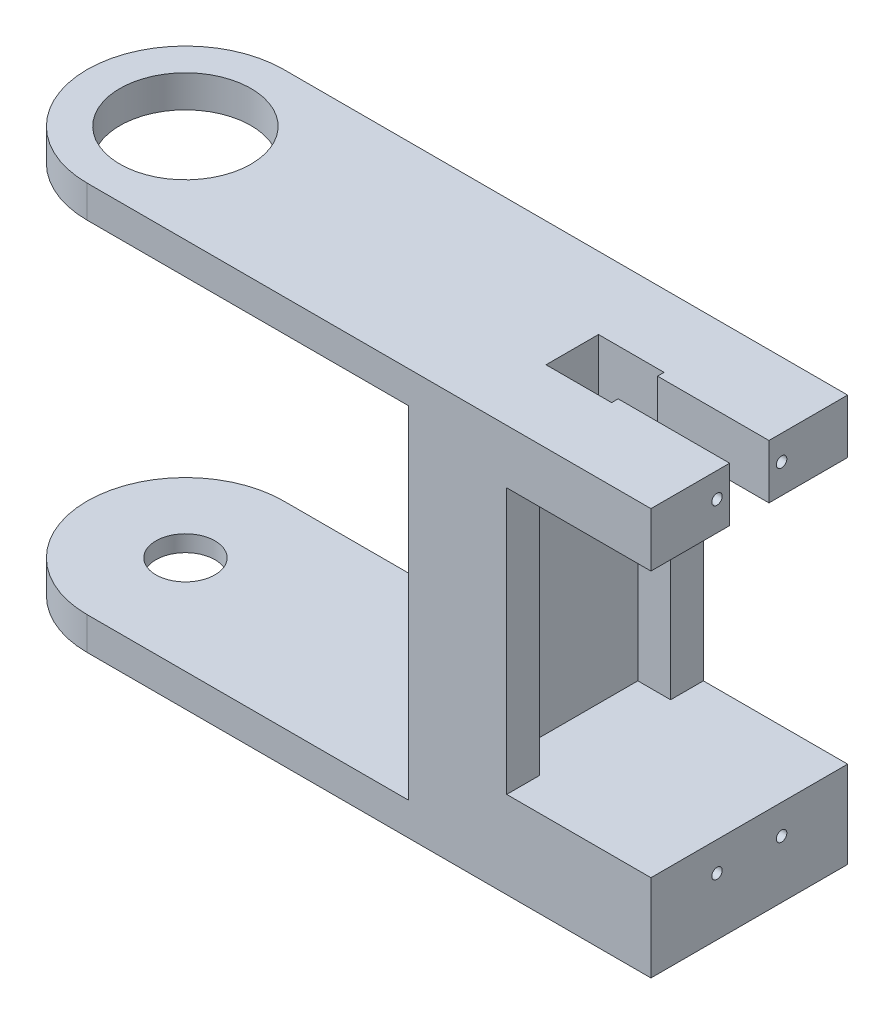
ISO-10303-21;
HEADER;
FILE_DESCRIPTION(('STEP AP214'),'2;1');
FILE_NAME('part.step','',(''),(''),'','','');
FILE_SCHEMA(('AUTOMOTIVE_DESIGN { 1 0 10303 214 1 1 1 1 }'));
ENDSEC;
DATA;
#1=APPLICATION_CONTEXT('core data for automotive mechanical design processes');
#2=APPLICATION_PROTOCOL_DEFINITION('international standard','automotive_design',2000,#1);
#3=PRODUCT_CONTEXT('',#1,'mechanical');
#4=PRODUCT('Part','Part','',(#3));
#5=PRODUCT_RELATED_PRODUCT_CATEGORY('part','',(#4));
#6=PRODUCT_DEFINITION_FORMATION('','',#4);
#7=PRODUCT_DEFINITION_CONTEXT('part definition',#1,'design');
#8=PRODUCT_DEFINITION('design','',#6,#7);
#9=PRODUCT_DEFINITION_SHAPE('','',#8);
#10=(LENGTH_UNIT() NAMED_UNIT(*) SI_UNIT(.MILLI.,.METRE.));
#11=(NAMED_UNIT(*) PLANE_ANGLE_UNIT() SI_UNIT($,.RADIAN.));
#12=(NAMED_UNIT(*) SI_UNIT($,.STERADIAN.) SOLID_ANGLE_UNIT());
#13=UNCERTAINTY_MEASURE_WITH_UNIT(LENGTH_MEASURE(1.E-05),#10,'distance_accuracy_value','');
#14=(GEOMETRIC_REPRESENTATION_CONTEXT(3) GLOBAL_UNCERTAINTY_ASSIGNED_CONTEXT((#13)) GLOBAL_UNIT_ASSIGNED_CONTEXT((#10,
#11,#12)) REPRESENTATION_CONTEXT('',''));
#15=CARTESIAN_POINT('',(0.,0.,0.));
#16=DIRECTION('',(0.,0.,1.));
#17=DIRECTION('',(1.,0.,0.));
#18=AXIS2_PLACEMENT_3D('',#15,#16,#17);
#19=CARTESIAN_POINT('',(-74.25,154.147469097395,15.));
#20=DIRECTION('',(0.,-1.,0.));
#21=DIRECTION('',(1.,0.,0.));
#22=AXIS2_PLACEMENT_3D('',#19,#20,#21);
#23=CYLINDRICAL_SURFACE('',#22,15.);
#24=DIRECTION('',(0.,-1.,0.));
#25=VECTOR('',#24,1.);
#26=CARTESIAN_POINT('',(-74.25,154.147469097395,30.));
#27=LINE('',#26,#25);
#28=CARTESIAN_POINT('',(-74.25,32.,30.));
#29=VERTEX_POINT('',#28);
#30=CARTESIAN_POINT('',(-74.25,27.,30.));
#31=VERTEX_POINT('',#30);
#32=EDGE_CURVE('E280',#29,#31,#27,.T.);
#33=ORIENTED_EDGE('',*,*,#32,.F.);
#34=CARTESIAN_POINT('',(-74.25,32.,15.));
#35=DIRECTION('',(0.,1.,0.));
#36=DIRECTION('',(0.,0.,1.));
#37=AXIS2_PLACEMENT_3D('',#34,#35,#36);
#38=CIRCLE('',#37,15.);
#39=CARTESIAN_POINT('',(-74.25,32.,0.));
#40=VERTEX_POINT('',#39);
#41=EDGE_CURVE('E12',#29,#40,#38,.F.);
#42=ORIENTED_EDGE('',*,*,#41,.T.);
#43=DIRECTION('',(0.,-1.,0.));
#44=VECTOR('',#43,1.);
#45=CARTESIAN_POINT('',(-74.25,154.147469097395,0.));
#46=LINE('',#45,#44);
#47=CARTESIAN_POINT('',(-74.25,27.,0.));
#48=VERTEX_POINT('',#47);
#49=EDGE_CURVE('E276',#40,#48,#46,.T.);
#50=ORIENTED_EDGE('',*,*,#49,.T.);
#51=CARTESIAN_POINT('',(-74.25,27.,15.));
#52=DIRECTION('',(0.,1.,0.));
#53=DIRECTION('',(1.,0.,0.));
#54=AXIS2_PLACEMENT_3D('',#51,#52,#53);
#55=CIRCLE('',#54,15.);
#56=EDGE_CURVE('E273',#48,#31,#55,.T.);
#57=ORIENTED_EDGE('',*,*,#56,.T.);
#58=EDGE_LOOP('',(#33,#42,#50,#57));
#59=FACE_BOUND('',#58,.T.);
#60=ADVANCED_FACE('F49',(#59),#23,.T.);
#61=CARTESIAN_POINT('',(-25.55,27.,-97.9443417280656));
#62=DIRECTION('',(0.,1.,0.));
#63=DIRECTION('',(-1.,0.,0.));
#64=AXIS2_PLACEMENT_3D('',#61,#62,#63);
#65=PLANE('',#64);
#66=CARTESIAN_POINT('',(-74.25,27.,15.));
#67=DIRECTION('',(0.,-1.,0.));
#68=DIRECTION('',(1.,0.,0.));
#69=AXIS2_PLACEMENT_3D('',#66,#67,#68);
#70=CIRCLE('',#69,10.5);
#71=CARTESIAN_POINT('',(-63.75,27.,15.));
#72=VERTEX_POINT('',#71);
#73=EDGE_CURVE('E261',#72,#72,#70,.T.);
#74=ORIENTED_EDGE('',*,*,#73,.F.);
#75=EDGE_LOOP('',(#74));
#76=FACE_BOUND('',#75,.T.);
#77=DIRECTION('',(-1.,0.,0.));
#78=VECTOR('',#77,1.);
#79=CARTESIAN_POINT('',(-25.55,27.,30.));
#80=LINE('',#79,#78);
#81=CARTESIAN_POINT('',(11.75,27.,30.));
#82=VERTEX_POINT('',#81);
#83=EDGE_CURVE('E499',#82,#31,#80,.T.);
#84=ORIENTED_EDGE('',*,*,#83,.T.);
#85=ORIENTED_EDGE('',*,*,#56,.F.);
#86=DIRECTION('',(1.,0.,0.));
#87=VECTOR('',#86,1.);
#88=CARTESIAN_POINT('',(-25.55,27.,0.));
#89=LINE('',#88,#87);
#90=CARTESIAN_POINT('',(11.75,27.,0.));
#91=VERTEX_POINT('',#90);
#92=EDGE_CURVE('E502',#48,#91,#89,.T.);
#93=ORIENTED_EDGE('',*,*,#92,.T.);
#94=DIRECTION('',(0.,0.,-1.));
#95=VECTOR('',#94,1.);
#96=CARTESIAN_POINT('',(11.75,27.,0.));
#97=LINE('',#96,#95);
#98=EDGE_CURVE('E257',#82,#91,#97,.T.);
#99=ORIENTED_EDGE('',*,*,#98,.F.);
#100=EDGE_LOOP('',(#84,#85,#93,#99));
#101=FACE_BOUND('',#100,.T.);
#102=ADVANCED_FACE('F548',(#76,#101),#65,.F.);
#103=CARTESIAN_POINT('',(-30.25,89.,-73.8782782690555));
#104=DIRECTION('',(0.,1.,0.));
#105=DIRECTION('',(0.,0.,1.));
#106=AXIS2_PLACEMENT_3D('',#103,#104,#105);
#107=PLANE('',#106);
#108=CARTESIAN_POINT('',(-74.25,89.,15.));
#109=DIRECTION('',(0.,1.,0.));
#110=DIRECTION('',(0.,0.,1.));
#111=AXIS2_PLACEMENT_3D('',#108,#109,#110);
#112=CIRCLE('',#111,15.);
#113=CARTESIAN_POINT('',(-74.25,89.,0.));
#114=VERTEX_POINT('',#113);
#115=CARTESIAN_POINT('',(-74.25,89.,30.));
#116=VERTEX_POINT('',#115);
#117=EDGE_CURVE('E277',#114,#116,#112,.T.);
#118=ORIENTED_EDGE('',*,*,#117,.T.);
#119=DIRECTION('',(-1.,0.,0.));
#120=VECTOR('',#119,1.);
#121=CARTESIAN_POINT('',(-30.25,89.,30.));
#122=LINE('',#121,#120);
#123=CARTESIAN_POINT('',(11.75,89.,30.));
#124=VERTEX_POINT('',#123);
#125=EDGE_CURVE('E495',#124,#116,#122,.T.);
#126=ORIENTED_EDGE('',*,*,#125,.F.);
#127=DIRECTION('',(0.,0.,1.));
#128=VECTOR('',#127,1.);
#129=CARTESIAN_POINT('',(11.75,89.,-73.8782782690555));
#130=LINE('',#129,#128);
#131=CARTESIAN_POINT('',(11.75,89.,18.));
#132=VERTEX_POINT('',#131);
#133=EDGE_CURVE('E506',#132,#124,#130,.T.);
#134=ORIENTED_EDGE('',*,*,#133,.F.);
#135=DIRECTION('',(1.,0.,0.));
#136=VECTOR('',#135,1.);
#137=CARTESIAN_POINT('',(-5.25000000000001,89.,18.));
#138=LINE('',#137,#136);
#139=CARTESIAN_POINT('',(-5.25000000000001,89.,18.));
#140=VERTEX_POINT('',#139);
#141=EDGE_CURVE('E391',#140,#132,#138,.T.);
#142=ORIENTED_EDGE('',*,*,#141,.F.);
#143=DIRECTION('',(0.,0.,-1.));
#144=VECTOR('',#143,1.);
#145=CARTESIAN_POINT('',(-5.25000000000001,89.,19.));
#146=LINE('',#145,#144);
#147=CARTESIAN_POINT('',(-5.25000000000001,89.,19.));
#148=VERTEX_POINT('',#147);
#149=EDGE_CURVE('E421',#148,#140,#146,.T.);
#150=ORIENTED_EDGE('',*,*,#149,.F.);
#151=DIRECTION('',(1.,0.,0.));
#152=VECTOR('',#151,1.);
#153=CARTESIAN_POINT('',(-15.25,89.,19.));
#154=LINE('',#153,#152);
#155=CARTESIAN_POINT('',(-15.25,89.,19.));
#156=VERTEX_POINT('',#155);
#157=EDGE_CURVE('E385',#156,#148,#154,.T.);
#158=ORIENTED_EDGE('',*,*,#157,.F.);
#159=DIRECTION('',(0.,0.,-1.));
#160=VECTOR('',#159,1.);
#161=CARTESIAN_POINT('',(-15.25,89.,19.));
#162=LINE('',#161,#160);
#163=CARTESIAN_POINT('',(-15.25,89.,11.));
#164=VERTEX_POINT('',#163);
#165=EDGE_CURVE('E398',#156,#164,#162,.T.);
#166=ORIENTED_EDGE('',*,*,#165,.T.);
#167=DIRECTION('',(1.,0.,0.));
#168=VECTOR('',#167,1.);
#169=CARTESIAN_POINT('',(-15.25,89.,11.));
#170=LINE('',#169,#168);
#171=CARTESIAN_POINT('',(-5.25000000000001,89.,11.));
#172=VERTEX_POINT('',#171);
#173=EDGE_CURVE('E436',#164,#172,#170,.T.);
#174=ORIENTED_EDGE('',*,*,#173,.T.);
#175=DIRECTION('',(0.,0.,1.));
#176=VECTOR('',#175,1.);
#177=CARTESIAN_POINT('',(-5.25000000000001,89.,11.));
#178=LINE('',#177,#176);
#179=CARTESIAN_POINT('',(-5.25000000000001,89.,12.));
#180=VERTEX_POINT('',#179);
#181=EDGE_CURVE('E431',#172,#180,#178,.T.);
#182=ORIENTED_EDGE('',*,*,#181,.T.);
#183=DIRECTION('',(1.,0.,0.));
#184=VECTOR('',#183,1.);
#185=CARTESIAN_POINT('',(-5.25000000000001,89.,12.));
#186=LINE('',#185,#184);
#187=CARTESIAN_POINT('',(11.75,89.,12.));
#188=VERTEX_POINT('',#187);
#189=EDGE_CURVE('E426',#180,#188,#186,.T.);
#190=ORIENTED_EDGE('',*,*,#189,.T.);
#191=CARTESIAN_POINT('',(11.75,89.,0.));
#192=VERTEX_POINT('',#191);
#193=EDGE_CURVE('E510',#192,#188,#130,.T.);
#194=ORIENTED_EDGE('',*,*,#193,.F.);
#195=DIRECTION('',(1.,0.,0.));
#196=VECTOR('',#195,1.);
#197=CARTESIAN_POINT('',(-30.25,89.,0.));
#198=LINE('',#197,#196);
#199=EDGE_CURVE('E496',#114,#192,#198,.T.);
#200=ORIENTED_EDGE('',*,*,#199,.F.);
#201=EDGE_LOOP('',(#118,#126,#134,#142,#150,#158,#166,#174,#182,#190,#194,#200));
#202=FACE_BOUND('',#201,.T.);
#203=CARTESIAN_POINT('',(-74.25,89.,15.));
#204=DIRECTION('',(0.,1.,0.));
#205=DIRECTION('',(0.,0.,1.));
#206=AXIS2_PLACEMENT_3D('',#203,#204,#205);
#207=CIRCLE('',#206,9.99999999999999);
#208=CARTESIAN_POINT('',(-64.25,89.,15.));
#209=VERTEX_POINT('',#208);
#210=EDGE_CURVE('E289',#209,#209,#207,.F.);
#211=ORIENTED_EDGE('',*,*,#210,.T.);
#212=EDGE_LOOP('',(#211));
#213=FACE_BOUND('',#212,.T.);
#214=ADVANCED_FACE('F572',(#202,#213),#107,.T.);
#215=CARTESIAN_POINT('',(-30.25,84.1,85.2268050859363));
#216=DIRECTION('',(0.,-1.,0.));
#217=DIRECTION('',(0.,0.,-1.));
#218=AXIS2_PLACEMENT_3D('',#215,#216,#217);
#219=PLANE('',#218);
#220=CARTESIAN_POINT('',(-74.25,84.1,15.));
#221=DIRECTION('',(0.,-1.,0.));
#222=DIRECTION('',(0.,0.,-1.));
#223=AXIS2_PLACEMENT_3D('',#220,#221,#222);
#224=CIRCLE('',#223,9.99999999999999);
#225=CARTESIAN_POINT('',(-64.25,84.1,15.));
#226=VERTEX_POINT('',#225);
#227=EDGE_CURVE('E293',#226,#226,#224,.T.);
#228=ORIENTED_EDGE('',*,*,#227,.F.);
#229=EDGE_LOOP('',(#228));
#230=FACE_BOUND('',#229,.T.);
#231=DIRECTION('',(-1.,0.,0.));
#232=VECTOR('',#231,1.);
#233=CARTESIAN_POINT('',(-30.25,84.1,30.));
#234=LINE('',#233,#232);
#235=CARTESIAN_POINT('',(-25.25,84.1,30.));
#236=VERTEX_POINT('',#235);
#237=CARTESIAN_POINT('',(-74.25,84.1,30.));
#238=VERTEX_POINT('',#237);
#239=EDGE_CURVE('E223',#236,#238,#234,.T.);
#240=ORIENTED_EDGE('',*,*,#239,.T.);
#241=CARTESIAN_POINT('',(-74.25,84.1,15.));
#242=DIRECTION('',(0.,-1.,0.));
#243=DIRECTION('',(0.,0.,-1.));
#244=AXIS2_PLACEMENT_3D('',#241,#242,#243);
#245=CIRCLE('',#244,15.);
#246=CARTESIAN_POINT('',(-74.25,84.1,0.));
#247=VERTEX_POINT('',#246);
#248=EDGE_CURVE('E286',#247,#238,#245,.F.);
#249=ORIENTED_EDGE('',*,*,#248,.F.);
#250=DIRECTION('',(-1.,0.,0.));
#251=VECTOR('',#250,1.);
#252=CARTESIAN_POINT('',(-30.25,84.1,0.));
#253=LINE('',#252,#251);
#254=CARTESIAN_POINT('',(-25.25,84.1,0.));
#255=VERTEX_POINT('',#254);
#256=EDGE_CURVE('E237',#255,#247,#253,.T.);
#257=ORIENTED_EDGE('',*,*,#256,.F.);
#258=DIRECTION('',(0.,0.,-1.));
#259=VECTOR('',#258,1.);
#260=CARTESIAN_POINT('',(-25.25,84.1,82.3393733244868));
#261=LINE('',#260,#259);
#262=EDGE_CURVE('E243',#236,#255,#261,.T.);
#263=ORIENTED_EDGE('',*,*,#262,.F.);
#264=EDGE_LOOP('',(#240,#249,#257,#263));
#265=FACE_BOUND('',#264,.T.);
#266=ADVANCED_FACE('F248',(#230,#265),#219,.T.);
#267=CARTESIAN_POINT('',(-30.25,32.,85.2268050859363));
#268=DIRECTION('',(0.,1.,0.));
#269=DIRECTION('',(0.,0.,1.));
#270=AXIS2_PLACEMENT_3D('',#267,#268,#269);
#271=PLANE('',#270);
#272=CARTESIAN_POINT('',(-74.25,32.,15.));
#273=DIRECTION('',(0.,1.,0.));
#274=DIRECTION('',(0.,0.,1.));
#275=AXIS2_PLACEMENT_3D('',#272,#273,#274);
#276=CIRCLE('',#275,4.5);
#277=CARTESIAN_POINT('',(-74.25,32.,19.5));
#278=VERTEX_POINT('',#277);
#279=EDGE_CURVE('E269',#278,#278,#276,.F.);
#280=ORIENTED_EDGE('',*,*,#279,.T.);
#281=EDGE_LOOP('',(#280));
#282=FACE_BOUND('',#281,.T.);
#283=DIRECTION('',(1.,0.,0.));
#284=VECTOR('',#283,1.);
#285=CARTESIAN_POINT('',(-30.25,32.,30.));
#286=LINE('',#285,#284);
#287=CARTESIAN_POINT('',(-25.25,32.,30.));
#288=VERTEX_POINT('',#287);
#289=EDGE_CURVE('E299',#29,#288,#286,.T.);
#290=ORIENTED_EDGE('',*,*,#289,.T.);
#291=DIRECTION('',(0.,0.,-1.));
#292=VECTOR('',#291,1.);
#293=CARTESIAN_POINT('',(-25.25,32.,82.3393733244868));
#294=LINE('',#293,#292);
#295=CARTESIAN_POINT('',(-25.25,32.,0.));
#296=VERTEX_POINT('',#295);
#297=EDGE_CURVE('E245',#288,#296,#294,.T.);
#298=ORIENTED_EDGE('',*,*,#297,.T.);
#299=DIRECTION('',(1.,0.,0.));
#300=VECTOR('',#299,1.);
#301=CARTESIAN_POINT('',(-30.25,32.,0.));
#302=LINE('',#301,#300);
#303=EDGE_CURVE('E66',#40,#296,#302,.T.);
#304=ORIENTED_EDGE('',*,*,#303,.F.);
#305=ORIENTED_EDGE('',*,*,#41,.F.);
#306=EDGE_LOOP('',(#290,#298,#304,#305));
#307=FACE_BOUND('',#306,.T.);
#308=ADVANCED_FACE('F555',(#282,#307),#271,.T.);
#309=CARTESIAN_POINT('',(-15.25,80.75,-78.4263811282179));
#310=DIRECTION('',(-1.,0.,0.));
#311=DIRECTION('',(0.,-1.,0.));
#312=AXIS2_PLACEMENT_3D('',#309,#310,#311);
#313=PLANE('',#312);
#314=DIRECTION('',(0.,-1.,0.));
#315=VECTOR('',#314,1.);
#316=CARTESIAN_POINT('',(-15.25,80.75,5.));
#317=LINE('',#316,#315);
#318=CARTESIAN_POINT('',(-15.25,80.75,4.99999999999998));
#319=VERTEX_POINT('',#318);
#320=CARTESIAN_POINT('',(-15.25,40.25,4.99999999999998));
#321=VERTEX_POINT('',#320);
#322=EDGE_CURVE('E335',#319,#321,#317,.T.);
#323=ORIENTED_EDGE('',*,*,#322,.F.);
#324=DIRECTION('',(0.,0.,1.));
#325=VECTOR('',#324,1.);
#326=CARTESIAN_POINT('',(-15.25,80.75,-78.4263811282179));
#327=LINE('',#326,#325);
#328=CARTESIAN_POINT('',(-15.25,80.75,11.));
#329=VERTEX_POINT('',#328);
#330=EDGE_CURVE('E457',#319,#329,#327,.T.);
#331=ORIENTED_EDGE('',*,*,#330,.T.);
#332=DIRECTION('',(0.,-1.,0.));
#333=VECTOR('',#332,1.);
#334=CARTESIAN_POINT('',(-15.25,139.635955604689,11.));
#335=LINE('',#334,#333);
#336=EDGE_CURVE('E418',#164,#329,#335,.T.);
#337=ORIENTED_EDGE('',*,*,#336,.F.);
#338=ORIENTED_EDGE('',*,*,#165,.F.);
#339=DIRECTION('',(0.,-1.,0.));
#340=VECTOR('',#339,1.);
#341=CARTESIAN_POINT('',(-15.25,139.635955604689,19.));
#342=LINE('',#341,#340);
#343=CARTESIAN_POINT('',(-15.25,80.75,19.));
#344=VERTEX_POINT('',#343);
#345=EDGE_CURVE('E409',#156,#344,#342,.T.);
#346=ORIENTED_EDGE('',*,*,#345,.T.);
#347=CARTESIAN_POINT('',(-15.25,80.75,25.));
#348=VERTEX_POINT('',#347);
#349=EDGE_CURVE('E481',#344,#348,#327,.T.);
#350=ORIENTED_EDGE('',*,*,#349,.T.);
#351=DIRECTION('',(0.,1.,0.));
#352=VECTOR('',#351,1.);
#353=CARTESIAN_POINT('',(-15.25,80.75,25.));
#354=LINE('',#353,#352);
#355=CARTESIAN_POINT('',(-15.25,40.25,25.));
#356=VERTEX_POINT('',#355);
#357=EDGE_CURVE('E362',#356,#348,#354,.T.);
#358=ORIENTED_EDGE('',*,*,#357,.F.);
#359=DIRECTION('',(0.,0.,1.));
#360=VECTOR('',#359,1.);
#361=CARTESIAN_POINT('',(-15.25,40.25,-78.4263811282179));
#362=LINE('',#361,#360);
#363=EDGE_CURVE('E478',#321,#356,#362,.T.);
#364=ORIENTED_EDGE('',*,*,#363,.F.);
#365=EDGE_LOOP('',(#323,#331,#337,#338,#346,#350,#358,#364));
#366=FACE_BOUND('',#365,.T.);
#367=ADVANCED_FACE('F589',(#366),#313,.F.);
#368=CARTESIAN_POINT('',(-15.25,40.25,-78.4263811282179));
#369=DIRECTION('',(0.,-1.,0.));
#370=DIRECTION('',(1.,0.,0.));
#371=AXIS2_PLACEMENT_3D('',#368,#369,#370);
#372=PLANE('',#371);
#373=DIRECTION('',(-1.,0.,0.));
#374=VECTOR('',#373,1.);
#375=CARTESIAN_POINT('',(-10.25,40.25,5.));
#376=LINE('',#375,#374);
#377=CARTESIAN_POINT('',(-10.25,40.25,5.));
#378=VERTEX_POINT('',#377);
#379=EDGE_CURVE('E352',#378,#321,#376,.T.);
#380=ORIENTED_EDGE('',*,*,#379,.T.);
#381=ORIENTED_EDGE('',*,*,#363,.T.);
#382=DIRECTION('',(-1.,0.,0.));
#383=VECTOR('',#382,1.);
#384=CARTESIAN_POINT('',(-10.25,40.25,25.));
#385=LINE('',#384,#383);
#386=CARTESIAN_POINT('',(-10.25,40.25,25.));
#387=VERTEX_POINT('',#386);
#388=EDGE_CURVE('E381',#387,#356,#385,.T.);
#389=ORIENTED_EDGE('',*,*,#388,.F.);
#390=DIRECTION('',(0.,0.,-1.));
#391=VECTOR('',#390,1.);
#392=CARTESIAN_POINT('',(-10.25,40.25,30.));
#393=LINE('',#392,#391);
#394=CARTESIAN_POINT('',(-10.25,40.25,30.));
#395=VERTEX_POINT('',#394);
#396=EDGE_CURVE('E366',#395,#387,#393,.T.);
#397=ORIENTED_EDGE('',*,*,#396,.F.);
#398=DIRECTION('',(1.,0.,0.));
#399=VECTOR('',#398,1.);
#400=CARTESIAN_POINT('',(-15.25,40.25,30.));
#401=LINE('',#400,#399);
#402=CARTESIAN_POINT('',(11.75,40.25,30.));
#403=VERTEX_POINT('',#402);
#404=EDGE_CURVE('E414',#395,#403,#401,.T.);
#405=ORIENTED_EDGE('',*,*,#404,.T.);
#406=DIRECTION('',(0.,0.,1.));
#407=VECTOR('',#406,1.);
#408=CARTESIAN_POINT('',(11.75,40.25,-78.4263811282179));
#409=LINE('',#408,#407);
#410=CARTESIAN_POINT('',(11.75,40.25,0.));
#411=VERTEX_POINT('',#410);
#412=EDGE_CURVE('E487',#411,#403,#409,.T.);
#413=ORIENTED_EDGE('',*,*,#412,.F.);
#414=DIRECTION('',(-1.,0.,0.));
#415=VECTOR('',#414,1.);
#416=CARTESIAN_POINT('',(-15.25,40.25,0.));
#417=LINE('',#416,#415);
#418=CARTESIAN_POINT('',(-10.25,40.25,0.));
#419=VERTEX_POINT('',#418);
#420=EDGE_CURVE('E464',#411,#419,#417,.T.);
#421=ORIENTED_EDGE('',*,*,#420,.T.);
#422=DIRECTION('',(0.,0.,-1.));
#423=VECTOR('',#422,1.);
#424=CARTESIAN_POINT('',(-10.25,40.25,0.));
#425=LINE('',#424,#423);
#426=EDGE_CURVE('E348',#378,#419,#425,.T.);
#427=ORIENTED_EDGE('',*,*,#426,.F.);
#428=EDGE_LOOP('',(#380,#381,#389,#397,#405,#413,#421,#427));
#429=FACE_BOUND('',#428,.T.);
#430=ADVANCED_FACE('F537',(#429),#372,.F.);
#431=CARTESIAN_POINT('',(-15.25,80.75,-78.4263811282179));
#432=DIRECTION('',(0.,1.,0.));
#433=DIRECTION('',(0.,0.,1.));
#434=AXIS2_PLACEMENT_3D('',#431,#432,#433);
#435=PLANE('',#434);
#436=DIRECTION('',(-1.,0.,0.));
#437=VECTOR('',#436,1.);
#438=CARTESIAN_POINT('',(-10.25,80.75,5.));
#439=LINE('',#438,#437);
#440=CARTESIAN_POINT('',(-10.25,80.75,5.));
#441=VERTEX_POINT('',#440);
#442=EDGE_CURVE('E358',#441,#319,#439,.T.);
#443=ORIENTED_EDGE('',*,*,#442,.F.);
#444=DIRECTION('',(0.,0.,1.));
#445=VECTOR('',#444,1.);
#446=CARTESIAN_POINT('',(-10.25,80.75,0.));
#447=LINE('',#446,#445);
#448=CARTESIAN_POINT('',(-10.25,80.75,0.));
#449=VERTEX_POINT('',#448);
#450=EDGE_CURVE('E340',#449,#441,#447,.T.);
#451=ORIENTED_EDGE('',*,*,#450,.F.);
#452=DIRECTION('',(1.,0.,0.));
#453=VECTOR('',#452,1.);
#454=CARTESIAN_POINT('',(-15.25,80.75,0.));
#455=LINE('',#454,#453);
#456=CARTESIAN_POINT('',(11.75,80.75,0.));
#457=VERTEX_POINT('',#456);
#458=EDGE_CURVE('E461',#449,#457,#455,.T.);
#459=ORIENTED_EDGE('',*,*,#458,.T.);
#460=DIRECTION('',(0.,0.,1.));
#461=VECTOR('',#460,1.);
#462=CARTESIAN_POINT('',(11.75,80.75,-78.4263811282179));
#463=LINE('',#462,#461);
#464=CARTESIAN_POINT('',(11.75,80.75,12.));
#465=VERTEX_POINT('',#464);
#466=EDGE_CURVE('E482',#457,#465,#463,.T.);
#467=ORIENTED_EDGE('',*,*,#466,.T.);
#468=DIRECTION('',(1.,0.,0.));
#469=VECTOR('',#468,1.);
#470=CARTESIAN_POINT('',(-5.25000000000001,80.75,12.));
#471=LINE('',#470,#469);
#472=CARTESIAN_POINT('',(-5.25000000000001,80.75,12.));
#473=VERTEX_POINT('',#472);
#474=EDGE_CURVE('E395',#473,#465,#471,.T.);
#475=ORIENTED_EDGE('',*,*,#474,.F.);
#476=DIRECTION('',(0.,0.,1.));
#477=VECTOR('',#476,1.);
#478=CARTESIAN_POINT('',(-5.25000000000001,80.75,11.));
#479=LINE('',#478,#477);
#480=CARTESIAN_POINT('',(-5.25000000000001,80.75,11.));
#481=VERTEX_POINT('',#480);
#482=EDGE_CURVE('E390',#481,#473,#479,.T.);
#483=ORIENTED_EDGE('',*,*,#482,.F.);
#484=DIRECTION('',(1.,0.,0.));
#485=VECTOR('',#484,1.);
#486=CARTESIAN_POINT('',(-15.25,80.75,11.));
#487=LINE('',#486,#485);
#488=EDGE_CURVE('E386',#329,#481,#487,.T.);
#489=ORIENTED_EDGE('',*,*,#488,.F.);
#490=ORIENTED_EDGE('',*,*,#330,.F.);
#491=EDGE_LOOP('',(#443,#451,#459,#467,#475,#483,#489,#490));
#492=FACE_BOUND('',#491,.T.);
#493=ADVANCED_FACE('F527',(#492),#435,.F.);
#494=DIRECTION('',(-1.,0.,0.));
#495=VECTOR('',#494,1.);
#496=CARTESIAN_POINT('',(-10.25,80.75,25.));
#497=LINE('',#496,#495);
#498=CARTESIAN_POINT('',(-10.25,80.75,25.));
#499=VERTEX_POINT('',#498);
#500=EDGE_CURVE('E375',#499,#348,#497,.T.);
#501=ORIENTED_EDGE('',*,*,#500,.T.);
#502=ORIENTED_EDGE('',*,*,#349,.F.);
#503=DIRECTION('',(1.,0.,0.));
#504=VECTOR('',#503,1.);
#505=CARTESIAN_POINT('',(-15.25,80.75,19.));
#506=LINE('',#505,#504);
#507=CARTESIAN_POINT('',(-5.25000000000001,80.75,19.));
#508=VERTEX_POINT('',#507);
#509=EDGE_CURVE('E410',#344,#508,#506,.T.);
#510=ORIENTED_EDGE('',*,*,#509,.T.);
#511=DIRECTION('',(0.,0.,-1.));
#512=VECTOR('',#511,1.);
#513=CARTESIAN_POINT('',(-5.25000000000001,80.75,19.));
#514=LINE('',#513,#512);
#515=CARTESIAN_POINT('',(-5.25000000000001,80.75,18.));
#516=VERTEX_POINT('',#515);
#517=EDGE_CURVE('E405',#508,#516,#514,.T.);
#518=ORIENTED_EDGE('',*,*,#517,.T.);
#519=DIRECTION('',(1.,0.,0.));
#520=VECTOR('',#519,1.);
#521=CARTESIAN_POINT('',(-5.25000000000001,80.75,18.));
#522=LINE('',#521,#520);
#523=CARTESIAN_POINT('',(11.75,80.75,18.));
#524=VERTEX_POINT('',#523);
#525=EDGE_CURVE('E399',#516,#524,#522,.T.);
#526=ORIENTED_EDGE('',*,*,#525,.T.);
#527=CARTESIAN_POINT('',(11.75,80.75,30.));
#528=VERTEX_POINT('',#527);
#529=EDGE_CURVE('E486',#524,#528,#463,.T.);
#530=ORIENTED_EDGE('',*,*,#529,.T.);
#531=DIRECTION('',(-1.,0.,0.));
#532=VECTOR('',#531,1.);
#533=CARTESIAN_POINT('',(-15.25,80.75,30.));
#534=LINE('',#533,#532);
#535=CARTESIAN_POINT('',(-10.25,80.75,30.));
#536=VERTEX_POINT('',#535);
#537=EDGE_CURVE('E474',#528,#536,#534,.T.);
#538=ORIENTED_EDGE('',*,*,#537,.T.);
#539=DIRECTION('',(0.,0.,1.));
#540=VECTOR('',#539,1.);
#541=CARTESIAN_POINT('',(-10.25,80.75,30.));
#542=LINE('',#541,#540);
#543=EDGE_CURVE('E372',#499,#536,#542,.T.);
#544=ORIENTED_EDGE('',*,*,#543,.F.);
#545=EDGE_LOOP('',(#501,#502,#510,#518,#526,#530,#538,#544));
#546=FACE_BOUND('',#545,.T.);
#547=ADVANCED_FACE('F604',(#546),#435,.F.);
#548=CARTESIAN_POINT('',(11.75,101.149817475309,-78.4263811282179));
#549=DIRECTION('',(-1.,0.,0.));
#550=DIRECTION('',(0.,0.,1.));
#551=AXIS2_PLACEMENT_3D('',#548,#549,#550);
#552=PLANE('',#551);
#553=CARTESIAN_POINT('',(11.75,85.21,19.925));
#554=DIRECTION('',(1.,0.,0.));
#555=DIRECTION('',(0.,0.,-1.));
#556=AXIS2_PLACEMENT_3D('',#553,#554,#555);
#557=CIRCLE('',#556,0.799999999999995);
#558=CARTESIAN_POINT('',(11.75,85.21,19.125));
#559=VERTEX_POINT('',#558);
#560=EDGE_CURVE('E236',#559,#559,#557,.T.);
#561=ORIENTED_EDGE('',*,*,#560,.F.);
#562=EDGE_LOOP('',(#561));
#563=FACE_BOUND('',#562,.T.);
#564=DIRECTION('',(0.,-1.,0.));
#565=VECTOR('',#564,1.);
#566=CARTESIAN_POINT('',(11.75,101.149817475309,18.));
#567=LINE('',#566,#565);
#568=EDGE_CURVE('E514',#132,#524,#567,.T.);
#569=ORIENTED_EDGE('',*,*,#568,.F.);
#570=ORIENTED_EDGE('',*,*,#133,.T.);
#571=DIRECTION('',(0.,-1.,0.));
#572=VECTOR('',#571,1.);
#573=CARTESIAN_POINT('',(11.75,101.149817475309,30.));
#574=LINE('',#573,#572);
#575=EDGE_CURVE('E470',#124,#528,#574,.T.);
#576=ORIENTED_EDGE('',*,*,#575,.T.);
#577=ORIENTED_EDGE('',*,*,#529,.F.);
#578=EDGE_LOOP('',(#569,#570,#576,#577));
#579=FACE_BOUND('',#578,.T.);
#580=ADVANCED_FACE('F565',(#563,#579),#552,.F.);
#581=CARTESIAN_POINT('',(0.,0.,30.));
#582=DIRECTION('',(0.,0.,1.));
#583=DIRECTION('',(1.,0.,0.));
#584=AXIS2_PLACEMENT_3D('',#581,#582,#583);
#585=PLANE('',#584);
#586=ORIENTED_EDGE('',*,*,#239,.F.);
#587=DIRECTION('',(0.,-1.,0.));
#588=VECTOR('',#587,1.);
#589=CARTESIAN_POINT('',(-25.25,84.1,30.));
#590=LINE('',#589,#588);
#591=EDGE_CURVE('E227',#236,#288,#590,.T.);
#592=ORIENTED_EDGE('',*,*,#591,.T.);
#593=ORIENTED_EDGE('',*,*,#289,.F.);
#594=ORIENTED_EDGE('',*,*,#32,.T.);
#595=ORIENTED_EDGE('',*,*,#83,.F.);
#596=DIRECTION('',(0.,-1.,0.));
#597=VECTOR('',#596,1.);
#598=CARTESIAN_POINT('',(11.75,40.25,30.));
#599=LINE('',#598,#597);
#600=EDGE_CURVE('E467',#403,#82,#599,.T.);
#601=ORIENTED_EDGE('',*,*,#600,.F.);
#602=ORIENTED_EDGE('',*,*,#404,.F.);
#603=DIRECTION('',(0.,-1.,0.));
#604=VECTOR('',#603,1.);
#605=CARTESIAN_POINT('',(-10.25,80.75,30.));
#606=LINE('',#605,#604);
#607=EDGE_CURVE('E363',#536,#395,#606,.T.);
#608=ORIENTED_EDGE('',*,*,#607,.F.);
#609=ORIENTED_EDGE('',*,*,#537,.F.);
#610=ORIENTED_EDGE('',*,*,#575,.F.);
#611=ORIENTED_EDGE('',*,*,#125,.T.);
#612=EDGE_CURVE('E230',#116,#238,#27,.T.);
#613=ORIENTED_EDGE('',*,*,#612,.T.);
#614=EDGE_LOOP('',(#586,#592,#593,#594,#595,#601,#602,#608,#609,#610,#611,#613));
#615=FACE_BOUND('',#614,.T.);
#616=ADVANCED_FACE('F225',(#615),#585,.T.);
#617=CARTESIAN_POINT('',(0.,0.,0.));
#618=DIRECTION('',(0.,0.,1.));
#619=DIRECTION('',(1.,0.,0.));
#620=AXIS2_PLACEMENT_3D('',#617,#618,#619);
#621=PLANE('',#620);
#622=DIRECTION('',(0.,-1.,0.));
#623=VECTOR('',#622,1.);
#624=CARTESIAN_POINT('',(-25.25,84.1,0.));
#625=LINE('',#624,#623);
#626=EDGE_CURVE('E251',#255,#296,#625,.T.);
#627=ORIENTED_EDGE('',*,*,#626,.F.);
#628=ORIENTED_EDGE('',*,*,#256,.T.);
#629=EDGE_CURVE('E281',#114,#247,#46,.T.);
#630=ORIENTED_EDGE('',*,*,#629,.F.);
#631=ORIENTED_EDGE('',*,*,#199,.T.);
#632=DIRECTION('',(0.,1.,0.));
#633=VECTOR('',#632,1.);
#634=CARTESIAN_POINT('',(11.75,101.149817475309,0.));
#635=LINE('',#634,#633);
#636=EDGE_CURVE('E456',#457,#192,#635,.T.);
#637=ORIENTED_EDGE('',*,*,#636,.F.);
#638=ORIENTED_EDGE('',*,*,#458,.F.);
#639=DIRECTION('',(0.,1.,0.));
#640=VECTOR('',#639,1.);
#641=CARTESIAN_POINT('',(-10.25,80.75,0.));
#642=LINE('',#641,#640);
#643=EDGE_CURVE('E336',#419,#449,#642,.T.);
#644=ORIENTED_EDGE('',*,*,#643,.F.);
#645=ORIENTED_EDGE('',*,*,#420,.F.);
#646=DIRECTION('',(0.,1.,0.));
#647=VECTOR('',#646,1.);
#648=CARTESIAN_POINT('',(11.75,40.25,0.));
#649=LINE('',#648,#647);
#650=EDGE_CURVE('E453',#91,#411,#649,.T.);
#651=ORIENTED_EDGE('',*,*,#650,.F.);
#652=ORIENTED_EDGE('',*,*,#92,.F.);
#653=ORIENTED_EDGE('',*,*,#49,.F.);
#654=ORIENTED_EDGE('',*,*,#303,.T.);
#655=EDGE_LOOP('',(#627,#628,#630,#631,#637,#638,#644,#645,#651,#652,#653,#654));
#656=FACE_BOUND('',#655,.T.);
#657=ADVANCED_FACE('F51',(#656),#621,.F.);
#658=CARTESIAN_POINT('',(11.75,85.21,10.075));
#659=DIRECTION('',(1.,0.,0.));
#660=DIRECTION('',(0.,0.,-1.));
#661=AXIS2_PLACEMENT_3D('',#658,#659,#660);
#662=CIRCLE('',#661,0.799999999999995);
#663=CARTESIAN_POINT('',(11.75,85.21,9.275));
#664=VERTEX_POINT('',#663);
#665=EDGE_CURVE('E311',#664,#664,#662,.T.);
#666=ORIENTED_EDGE('',*,*,#665,.F.);
#667=EDGE_LOOP('',(#666));
#668=FACE_BOUND('',#667,.T.);
#669=ORIENTED_EDGE('',*,*,#193,.T.);
#670=DIRECTION('',(0.,-1.,0.));
#671=VECTOR('',#670,1.);
#672=CARTESIAN_POINT('',(11.75,101.149817475309,12.));
#673=LINE('',#672,#671);
#674=EDGE_CURVE('E59',#188,#465,#673,.T.);
#675=ORIENTED_EDGE('',*,*,#674,.T.);
#676=ORIENTED_EDGE('',*,*,#466,.F.);
#677=ORIENTED_EDGE('',*,*,#636,.T.);
#678=EDGE_LOOP('',(#669,#675,#676,#677));
#679=FACE_BOUND('',#678,.T.);
#680=ADVANCED_FACE('F521',(#668,#679),#552,.F.);
#681=CARTESIAN_POINT('',(11.75,40.25,-78.4263811282179));
#682=DIRECTION('',(-1.,0.,0.));
#683=DIRECTION('',(0.,-1.,0.));
#684=AXIS2_PLACEMENT_3D('',#681,#682,#683);
#685=PLANE('',#684);
#686=CARTESIAN_POINT('',(11.75,35.79,10.075));
#687=DIRECTION('',(1.,0.,0.));
#688=DIRECTION('',(0.,0.,-1.));
#689=AXIS2_PLACEMENT_3D('',#686,#687,#688);
#690=CIRCLE('',#689,0.799999999999988);
#691=CARTESIAN_POINT('',(11.75,35.79,9.275));
#692=VERTEX_POINT('',#691);
#693=EDGE_CURVE('E319',#692,#692,#690,.T.);
#694=ORIENTED_EDGE('',*,*,#693,.F.);
#695=EDGE_LOOP('',(#694));
#696=FACE_BOUND('',#695,.T.);
#697=CARTESIAN_POINT('',(11.75,35.79,19.925));
#698=DIRECTION('',(1.,0.,0.));
#699=DIRECTION('',(0.,0.,-1.));
#700=AXIS2_PLACEMENT_3D('',#697,#698,#699);
#701=CIRCLE('',#700,0.799999999999988);
#702=CARTESIAN_POINT('',(11.75,35.79,19.125));
#703=VERTEX_POINT('',#702);
#704=EDGE_CURVE('E327',#703,#703,#701,.T.);
#705=ORIENTED_EDGE('',*,*,#704,.F.);
#706=EDGE_LOOP('',(#705));
#707=FACE_BOUND('',#706,.T.);
#708=ORIENTED_EDGE('',*,*,#650,.T.);
#709=ORIENTED_EDGE('',*,*,#412,.T.);
#710=ORIENTED_EDGE('',*,*,#600,.T.);
#711=ORIENTED_EDGE('',*,*,#98,.T.);
#712=EDGE_LOOP('',(#708,#709,#710,#711));
#713=FACE_BOUND('',#712,.T.);
#714=ADVANCED_FACE('F543',(#696,#707,#713),#685,.F.);
#715=CARTESIAN_POINT('',(-5.25000000000001,139.635955604689,12.));
#716=DIRECTION('',(0.,0.,-1.));
#717=DIRECTION('',(-1.,0.,0.));
#718=AXIS2_PLACEMENT_3D('',#715,#716,#717);
#719=PLANE('',#718);
#720=ORIENTED_EDGE('',*,*,#189,.F.);
#721=DIRECTION('',(0.,-1.,0.));
#722=VECTOR('',#721,1.);
#723=CARTESIAN_POINT('',(-5.25000000000001,139.635955604689,12.));
#724=LINE('',#723,#722);
#725=EDGE_CURVE('E430',#180,#473,#724,.T.);
#726=ORIENTED_EDGE('',*,*,#725,.T.);
#727=ORIENTED_EDGE('',*,*,#474,.T.);
#728=ORIENTED_EDGE('',*,*,#674,.F.);
#729=EDGE_LOOP('',(#720,#726,#727,#728));
#730=FACE_BOUND('',#729,.T.);
#731=ADVANCED_FACE('F579',(#730),#719,.F.);
#732=CARTESIAN_POINT('',(-5.25000000000001,139.635955604689,18.));
#733=DIRECTION('',(0.,0.,-1.));
#734=DIRECTION('',(-1.,0.,0.));
#735=AXIS2_PLACEMENT_3D('',#732,#733,#734);
#736=PLANE('',#735);
#737=ORIENTED_EDGE('',*,*,#568,.T.);
#738=ORIENTED_EDGE('',*,*,#525,.F.);
#739=DIRECTION('',(0.,-1.,0.));
#740=VECTOR('',#739,1.);
#741=CARTESIAN_POINT('',(-5.25000000000001,139.635955604689,18.));
#742=LINE('',#741,#740);
#743=EDGE_CURVE('E404',#140,#516,#742,.T.);
#744=ORIENTED_EDGE('',*,*,#743,.F.);
#745=ORIENTED_EDGE('',*,*,#141,.T.);
#746=EDGE_LOOP('',(#737,#738,#744,#745));
#747=FACE_BOUND('',#746,.T.);
#748=ADVANCED_FACE('F616',(#747),#736,.T.);
#749=CARTESIAN_POINT('',(-15.25,139.635955604689,11.));
#750=DIRECTION('',(0.,0.,-1.));
#751=DIRECTION('',(-1.,0.,0.));
#752=AXIS2_PLACEMENT_3D('',#749,#750,#751);
#753=PLANE('',#752);
#754=ORIENTED_EDGE('',*,*,#336,.T.);
#755=ORIENTED_EDGE('',*,*,#488,.T.);
#756=DIRECTION('',(0.,-1.,0.));
#757=VECTOR('',#756,1.);
#758=CARTESIAN_POINT('',(-5.25000000000001,139.635955604689,11.));
#759=LINE('',#758,#757);
#760=EDGE_CURVE('E435',#172,#481,#759,.T.);
#761=ORIENTED_EDGE('',*,*,#760,.F.);
#762=ORIENTED_EDGE('',*,*,#173,.F.);
#763=EDGE_LOOP('',(#754,#755,#761,#762));
#764=FACE_BOUND('',#763,.T.);
#765=ADVANCED_FACE('F586',(#764),#753,.F.);
#766=CARTESIAN_POINT('',(-5.25000000000001,139.635955604689,11.));
#767=DIRECTION('',(1.,0.,0.));
#768=DIRECTION('',(0.,0.,-1.));
#769=AXIS2_PLACEMENT_3D('',#766,#767,#768);
#770=PLANE('',#769);
#771=ORIENTED_EDGE('',*,*,#760,.T.);
#772=ORIENTED_EDGE('',*,*,#482,.T.);
#773=ORIENTED_EDGE('',*,*,#725,.F.);
#774=ORIENTED_EDGE('',*,*,#181,.F.);
#775=EDGE_LOOP('',(#771,#772,#773,#774));
#776=FACE_BOUND('',#775,.T.);
#777=ADVANCED_FACE('F581',(#776),#770,.F.);
#778=CARTESIAN_POINT('',(-5.25000000000001,139.635955604689,19.));
#779=DIRECTION('',(-1.,0.,0.));
#780=DIRECTION('',(0.,0.,1.));
#781=AXIS2_PLACEMENT_3D('',#778,#779,#780);
#782=PLANE('',#781);
#783=ORIENTED_EDGE('',*,*,#149,.T.);
#784=ORIENTED_EDGE('',*,*,#743,.T.);
#785=ORIENTED_EDGE('',*,*,#517,.F.);
#786=DIRECTION('',(0.,-1.,0.));
#787=VECTOR('',#786,1.);
#788=CARTESIAN_POINT('',(-5.25000000000001,139.635955604689,19.));
#789=LINE('',#788,#787);
#790=EDGE_CURVE('E403',#148,#508,#789,.T.);
#791=ORIENTED_EDGE('',*,*,#790,.F.);
#792=EDGE_LOOP('',(#783,#784,#785,#791));
#793=FACE_BOUND('',#792,.T.);
#794=ADVANCED_FACE('F599',(#793),#782,.T.);
#795=CARTESIAN_POINT('',(-15.25,139.635955604689,19.));
#796=DIRECTION('',(0.,0.,-1.));
#797=DIRECTION('',(-1.,0.,0.));
#798=AXIS2_PLACEMENT_3D('',#795,#796,#797);
#799=PLANE('',#798);
#800=ORIENTED_EDGE('',*,*,#157,.T.);
#801=ORIENTED_EDGE('',*,*,#790,.T.);
#802=ORIENTED_EDGE('',*,*,#509,.F.);
#803=ORIENTED_EDGE('',*,*,#345,.F.);
#804=EDGE_LOOP('',(#800,#801,#802,#803));
#805=FACE_BOUND('',#804,.T.);
#806=ADVANCED_FACE('F595',(#805),#799,.T.);
#807=CARTESIAN_POINT('',(-10.25,80.75,25.));
#808=DIRECTION('',(0.,0.,1.));
#809=DIRECTION('',(0.,-1.,0.));
#810=AXIS2_PLACEMENT_3D('',#807,#808,#809);
#811=PLANE('',#810);
#812=ORIENTED_EDGE('',*,*,#357,.T.);
#813=ORIENTED_EDGE('',*,*,#500,.F.);
#814=DIRECTION('',(0.,1.,0.));
#815=VECTOR('',#814,1.);
#816=CARTESIAN_POINT('',(-10.25,80.75,25.));
#817=LINE('',#816,#815);
#818=EDGE_CURVE('E369',#387,#499,#817,.T.);
#819=ORIENTED_EDGE('',*,*,#818,.F.);
#820=ORIENTED_EDGE('',*,*,#388,.T.);
#821=EDGE_LOOP('',(#812,#813,#819,#820));
#822=FACE_BOUND('',#821,.T.);
#823=ADVANCED_FACE('F609',(#822),#811,.F.);
#824=CARTESIAN_POINT('',(-10.25,0.,0.));
#825=DIRECTION('',(1.,0.,0.));
#826=DIRECTION('',(0.,1.,0.));
#827=AXIS2_PLACEMENT_3D('',#824,#825,#826);
#828=PLANE('',#827);
#829=ORIENTED_EDGE('',*,*,#607,.T.);
#830=ORIENTED_EDGE('',*,*,#396,.T.);
#831=ORIENTED_EDGE('',*,*,#818,.T.);
#832=ORIENTED_EDGE('',*,*,#543,.T.);
#833=EDGE_LOOP('',(#829,#830,#831,#832));
#834=FACE_BOUND('',#833,.T.);
#835=ADVANCED_FACE('F692',(#834),#828,.T.);
#836=CARTESIAN_POINT('',(-10.25,80.75,5.));
#837=DIRECTION('',(0.,0.,-1.));
#838=DIRECTION('',(0.,1.,0.));
#839=AXIS2_PLACEMENT_3D('',#836,#837,#838);
#840=PLANE('',#839);
#841=ORIENTED_EDGE('',*,*,#322,.T.);
#842=ORIENTED_EDGE('',*,*,#379,.F.);
#843=DIRECTION('',(0.,-1.,0.));
#844=VECTOR('',#843,1.);
#845=CARTESIAN_POINT('',(-10.25,80.75,5.));
#846=LINE('',#845,#844);
#847=EDGE_CURVE('E344',#441,#378,#846,.T.);
#848=ORIENTED_EDGE('',*,*,#847,.F.);
#849=ORIENTED_EDGE('',*,*,#442,.T.);
#850=EDGE_LOOP('',(#841,#842,#848,#849));
#851=FACE_BOUND('',#850,.T.);
#852=ADVANCED_FACE('F689',(#851),#840,.F.);
#853=CARTESIAN_POINT('',(-10.25,0.,0.));
#854=DIRECTION('',(-1.,0.,0.));
#855=DIRECTION('',(0.,-1.,0.));
#856=AXIS2_PLACEMENT_3D('',#853,#854,#855);
#857=PLANE('',#856);
#858=ORIENTED_EDGE('',*,*,#643,.T.);
#859=ORIENTED_EDGE('',*,*,#450,.T.);
#860=ORIENTED_EDGE('',*,*,#847,.T.);
#861=ORIENTED_EDGE('',*,*,#426,.T.);
#862=EDGE_LOOP('',(#858,#859,#860,#861));
#863=FACE_BOUND('',#862,.T.);
#864=ADVANCED_FACE('F533',(#863),#857,.F.);
#865=CARTESIAN_POINT('',(-5.25,35.79,19.925));
#866=DIRECTION('',(1.,0.,0.));
#867=DIRECTION('',(0.,0.,-1.));
#868=AXIS2_PLACEMENT_3D('',#865,#866,#867);
#869=CONICAL_SURFACE('',#868,0.799999999999988,1.02974425867664);
#870=CARTESIAN_POINT('',(-5.73068849522205,35.79,19.925));
#871=VERTEX_POINT('',#870);
#872=VERTEX_LOOP('',#871);
#873=FACE_BOUND('',#872,.T.);
#874=CARTESIAN_POINT('',(-5.25,35.79,19.925));
#875=DIRECTION('',(1.,0.,0.));
#876=DIRECTION('',(0.,0.,-1.));
#877=AXIS2_PLACEMENT_3D('',#874,#875,#876);
#878=CIRCLE('',#877,0.799999999999988);
#879=CARTESIAN_POINT('',(-5.25,35.79,19.125));
#880=VERTEX_POINT('',#879);
#881=EDGE_CURVE('E331',#880,#880,#878,.T.);
#882=ORIENTED_EDGE('',*,*,#881,.T.);
#883=EDGE_LOOP('',(#882));
#884=FACE_BOUND('',#883,.T.);
#885=ADVANCED_FACE('F682',(#873,#884),#869,.F.);
#886=CARTESIAN_POINT('',(11.75,35.79,19.925));
#887=DIRECTION('',(1.,0.,0.));
#888=DIRECTION('',(0.,0.,-1.));
#889=AXIS2_PLACEMENT_3D('',#886,#887,#888);
#890=CYLINDRICAL_SURFACE('',#889,0.799999999999988);
#891=ORIENTED_EDGE('',*,*,#881,.F.);
#892=EDGE_LOOP('',(#891));
#893=FACE_BOUND('',#892,.T.);
#894=ORIENTED_EDGE('',*,*,#704,.T.);
#895=EDGE_LOOP('',(#894));
#896=FACE_BOUND('',#895,.T.);
#897=ADVANCED_FACE('F678',(#893,#896),#890,.F.);
#898=CARTESIAN_POINT('',(-5.25,35.79,10.075));
#899=DIRECTION('',(1.,0.,0.));
#900=DIRECTION('',(0.,0.,-1.));
#901=AXIS2_PLACEMENT_3D('',#898,#899,#900);
#902=CONICAL_SURFACE('',#901,0.799999999999988,1.02974425867664);
#903=CARTESIAN_POINT('',(-5.73068849522205,35.79,10.075));
#904=VERTEX_POINT('',#903);
#905=VERTEX_LOOP('',#904);
#906=FACE_BOUND('',#905,.T.);
#907=CARTESIAN_POINT('',(-5.25,35.79,10.075));
#908=DIRECTION('',(1.,0.,0.));
#909=DIRECTION('',(0.,0.,-1.));
#910=AXIS2_PLACEMENT_3D('',#907,#908,#909);
#911=CIRCLE('',#910,0.799999999999988);
#912=CARTESIAN_POINT('',(-5.25,35.79,9.275));
#913=VERTEX_POINT('',#912);
#914=EDGE_CURVE('E323',#913,#913,#911,.T.);
#915=ORIENTED_EDGE('',*,*,#914,.T.);
#916=EDGE_LOOP('',(#915));
#917=FACE_BOUND('',#916,.T.);
#918=ADVANCED_FACE('F674',(#906,#917),#902,.F.);
#919=CARTESIAN_POINT('',(11.75,35.79,10.075));
#920=DIRECTION('',(1.,0.,0.));
#921=DIRECTION('',(0.,0.,-1.));
#922=AXIS2_PLACEMENT_3D('',#919,#920,#921);
#923=CYLINDRICAL_SURFACE('',#922,0.799999999999988);
#924=ORIENTED_EDGE('',*,*,#914,.F.);
#925=EDGE_LOOP('',(#924));
#926=FACE_BOUND('',#925,.T.);
#927=ORIENTED_EDGE('',*,*,#693,.T.);
#928=EDGE_LOOP('',(#927));
#929=FACE_BOUND('',#928,.T.);
#930=ADVANCED_FACE('F670',(#926,#929),#923,.F.);
#931=CARTESIAN_POINT('',(-5.25000000000001,85.21,10.075));
#932=DIRECTION('',(1.,0.,0.));
#933=DIRECTION('',(0.,0.,-1.));
#934=AXIS2_PLACEMENT_3D('',#931,#932,#933);
#935=CONICAL_SURFACE('',#934,0.799999999999981,1.02974425867664);
#936=CARTESIAN_POINT('',(-5.73068849522206,85.21,10.075));
#937=VERTEX_POINT('',#936);
#938=VERTEX_LOOP('',#937);
#939=FACE_BOUND('',#938,.T.);
#940=CARTESIAN_POINT('',(-5.25000000000001,85.21,10.075));
#941=DIRECTION('',(1.,0.,0.));
#942=DIRECTION('',(0.,0.,-1.));
#943=AXIS2_PLACEMENT_3D('',#940,#941,#942);
#944=CIRCLE('',#943,0.799999999999981);
#945=CARTESIAN_POINT('',(-5.25000000000001,85.21,9.27500000000001));
#946=VERTEX_POINT('',#945);
#947=EDGE_CURVE('E315',#946,#946,#944,.T.);
#948=ORIENTED_EDGE('',*,*,#947,.T.);
#949=EDGE_LOOP('',(#948));
#950=FACE_BOUND('',#949,.T.);
#951=ADVANCED_FACE('F666',(#939,#950),#935,.F.);
#952=CARTESIAN_POINT('',(11.75,85.21,10.075));
#953=DIRECTION('',(1.,0.,0.));
#954=DIRECTION('',(0.,0.,-1.));
#955=AXIS2_PLACEMENT_3D('',#952,#953,#954);
#956=CYLINDRICAL_SURFACE('',#955,0.799999999999988);
#957=ORIENTED_EDGE('',*,*,#947,.F.);
#958=EDGE_LOOP('',(#957));
#959=FACE_BOUND('',#958,.T.);
#960=ORIENTED_EDGE('',*,*,#665,.T.);
#961=EDGE_LOOP('',(#960));
#962=FACE_BOUND('',#961,.T.);
#963=ADVANCED_FACE('F662',(#959,#962),#956,.F.);
#964=CARTESIAN_POINT('',(-5.25000000000001,85.21,19.925));
#965=DIRECTION('',(1.,0.,0.));
#966=DIRECTION('',(0.,0.,-1.));
#967=AXIS2_PLACEMENT_3D('',#964,#965,#966);
#968=CONICAL_SURFACE('',#967,0.799999999999981,1.02974425867664);
#969=CARTESIAN_POINT('',(-5.73068849522206,85.21,19.925));
#970=VERTEX_POINT('',#969);
#971=VERTEX_LOOP('',#970);
#972=FACE_BOUND('',#971,.T.);
#973=CARTESIAN_POINT('',(-5.25000000000001,85.21,19.925));
#974=DIRECTION('',(1.,0.,0.));
#975=DIRECTION('',(0.,0.,-1.));
#976=AXIS2_PLACEMENT_3D('',#973,#974,#975);
#977=CIRCLE('',#976,0.799999999999981);
#978=CARTESIAN_POINT('',(-5.25000000000001,85.21,19.125));
#979=VERTEX_POINT('',#978);
#980=EDGE_CURVE('E307',#979,#979,#977,.T.);
#981=ORIENTED_EDGE('',*,*,#980,.T.);
#982=EDGE_LOOP('',(#981));
#983=FACE_BOUND('',#982,.T.);
#984=ADVANCED_FACE('F649',(#972,#983),#968,.F.);
#985=CARTESIAN_POINT('',(11.75,85.21,19.925));
#986=DIRECTION('',(1.,0.,0.));
#987=DIRECTION('',(0.,0.,-1.));
#988=AXIS2_PLACEMENT_3D('',#985,#986,#987);
#989=CYLINDRICAL_SURFACE('',#988,0.799999999999988);
#990=ORIENTED_EDGE('',*,*,#980,.F.);
#991=EDGE_LOOP('',(#990));
#992=FACE_BOUND('',#991,.T.);
#993=ORIENTED_EDGE('',*,*,#560,.T.);
#994=EDGE_LOOP('',(#993));
#995=FACE_BOUND('',#994,.T.);
#996=ADVANCED_FACE('F644',(#992,#995),#989,.F.);
#997=CARTESIAN_POINT('',(-74.25,117.284271247462,15.));
#998=DIRECTION('',(0.,-1.,0.));
#999=DIRECTION('',(1.,0.,0.));
#1000=AXIS2_PLACEMENT_3D('',#997,#998,#999);
#1001=CYLINDRICAL_SURFACE('',#1000,9.99999999999999);
#1002=CARTESIAN_POINT('',(-64.25,84.1,15.));
#1003=CARTESIAN_POINT('',(-64.25,84.1510416666667,15.));
#1004=CARTESIAN_POINT('',(-64.25,84.2020833333333,15.));
#1005=CARTESIAN_POINT('',(-64.25,84.3041666666667,15.));
#1006=CARTESIAN_POINT('',(-64.25,84.3552083333334,15.));
#1007=CARTESIAN_POINT('',(-64.25,84.4572916666667,15.));
#1008=CARTESIAN_POINT('',(-64.25,84.5083333333334,15.));
#1009=CARTESIAN_POINT('',(-64.25,84.6104166666667,15.));
#1010=CARTESIAN_POINT('',(-64.25,84.6614583333333,15.));
#1011=CARTESIAN_POINT('',(-64.25,84.7635416666667,15.));
#1012=CARTESIAN_POINT('',(-64.25,84.8145833333333,15.));
#1013=CARTESIAN_POINT('',(-64.25,84.9166666666667,15.));
#1014=CARTESIAN_POINT('',(-64.25,84.9677083333333,15.));
#1015=CARTESIAN_POINT('',(-64.25,85.0697916666667,15.));
#1016=CARTESIAN_POINT('',(-64.25,85.1208333333333,15.));
#1017=CARTESIAN_POINT('',(-64.25,85.2229166666667,15.));
#1018=CARTESIAN_POINT('',(-64.25,85.2739583333333,15.));
#1019=CARTESIAN_POINT('',(-64.25,85.3760416666667,15.));
#1020=CARTESIAN_POINT('',(-64.25,85.4270833333333,15.));
#1021=CARTESIAN_POINT('',(-64.25,85.5291666666667,15.));
#1022=CARTESIAN_POINT('',(-64.25,85.5802083333333,15.));
#1023=CARTESIAN_POINT('',(-64.25,85.6822916666667,15.));
#1024=CARTESIAN_POINT('',(-64.25,85.7333333333333,15.));
#1025=CARTESIAN_POINT('',(-64.25,85.8354166666667,15.));
#1026=CARTESIAN_POINT('',(-64.25,85.8864583333333,15.));
#1027=CARTESIAN_POINT('',(-64.25,85.9885416666667,15.));
#1028=CARTESIAN_POINT('',(-64.25,86.0395833333333,15.));
#1029=CARTESIAN_POINT('',(-64.25,86.1416666666667,15.));
#1030=CARTESIAN_POINT('',(-64.25,86.1927083333333,15.));
#1031=CARTESIAN_POINT('',(-64.25,86.2947916666667,15.));
#1032=CARTESIAN_POINT('',(-64.25,86.3458333333333,15.));
#1033=CARTESIAN_POINT('',(-64.25,86.4479166666667,15.));
#1034=CARTESIAN_POINT('',(-64.25,86.4989583333333,15.));
#1035=CARTESIAN_POINT('',(-64.25,86.6010416666667,15.));
#1036=CARTESIAN_POINT('',(-64.25,86.6520833333333,15.));
#1037=CARTESIAN_POINT('',(-64.25,86.7541666666667,15.));
#1038=CARTESIAN_POINT('',(-64.25,86.8052083333333,15.));
#1039=CARTESIAN_POINT('',(-64.25,86.9072916666667,15.));
#1040=CARTESIAN_POINT('',(-64.25,86.9583333333333,15.));
#1041=CARTESIAN_POINT('',(-64.25,87.0604166666667,15.));
#1042=CARTESIAN_POINT('',(-64.25,87.1114583333333,15.));
#1043=CARTESIAN_POINT('',(-64.25,87.2135416666667,15.));
#1044=CARTESIAN_POINT('',(-64.25,87.2645833333333,15.));
#1045=CARTESIAN_POINT('',(-64.25,87.3666666666667,15.));
#1046=CARTESIAN_POINT('',(-64.25,87.4177083333333,15.));
#1047=CARTESIAN_POINT('',(-64.25,87.5197916666667,15.));
#1048=CARTESIAN_POINT('',(-64.25,87.5708333333333,15.));
#1049=CARTESIAN_POINT('',(-64.25,87.6729166666667,15.));
#1050=CARTESIAN_POINT('',(-64.25,87.7239583333333,15.));
#1051=CARTESIAN_POINT('',(-64.25,87.8260416666667,15.));
#1052=CARTESIAN_POINT('',(-64.25,87.8770833333333,15.));
#1053=CARTESIAN_POINT('',(-64.25,87.9791666666667,15.));
#1054=CARTESIAN_POINT('',(-64.25,88.0302083333333,15.));
#1055=CARTESIAN_POINT('',(-64.25,88.1322916666667,15.));
#1056=CARTESIAN_POINT('',(-64.25,88.1833333333333,15.));
#1057=CARTESIAN_POINT('',(-64.25,88.2854166666667,15.));
#1058=CARTESIAN_POINT('',(-64.25,88.3364583333333,15.));
#1059=CARTESIAN_POINT('',(-64.25,88.4385416666667,15.));
#1060=CARTESIAN_POINT('',(-64.25,88.4895833333333,15.));
#1061=CARTESIAN_POINT('',(-64.25,88.5916666666667,15.));
#1062=CARTESIAN_POINT('',(-64.25,88.6427083333333,15.));
#1063=CARTESIAN_POINT('',(-64.25,88.7447916666667,15.));
#1064=CARTESIAN_POINT('',(-64.25,88.7958333333333,15.));
#1065=CARTESIAN_POINT('',(-64.25,88.8979166666667,15.));
#1066=CARTESIAN_POINT('',(-64.25,88.9489583333333,15.));
#1067=CARTESIAN_POINT('',(-64.25,89.,15.));
#1068=B_SPLINE_CURVE_WITH_KNOTS('',3,(#1002,#1003,#1004,#1005,#1006,#1007,#1008,#1009,#1010,
#1011,#1012,#1013,#1014,#1015,#1016,#1017,#1018,#1019,#1020,#1021,#1022,#1023,#1024,#1025,#1026,
#1027,#1028,#1029,#1030,#1031,#1032,#1033,#1034,#1035,#1036,#1037,#1038,#1039,#1040,#1041,#1042,
#1043,#1044,#1045,#1046,#1047,#1048,#1049,#1050,#1051,#1052,#1053,#1054,#1055,#1056,#1057,#1058,
#1059,#1060,#1061,#1062,#1063,#1064,#1065,#1066,#1067),.UNSPECIFIED.,.F.,.F.,(4,2,2,2,2,2,2,2,2,
2,2,2,2,2,2,2,2,2,2,2,2,2,2,2,2,2,2,2,2,2,2,2,4),(0.,0.153125000000004,0.306250000000008,
0.459375000000012,0.612500000000002,0.765625000000006,0.918749999999996,1.071875,1.225,
1.37812500000001,1.53125,1.68437499999999,1.83749999999999,1.990625,2.14375,2.29687499999999,
2.44999999999999,2.60312499999998,2.75624999999999,2.90937499999999,3.06249999999998,
3.21562499999999,3.36874999999999,3.52187499999998,3.67499999999998,3.82812499999999,
3.98124999999998,4.13437499999998,4.28749999999999,4.44062499999998,4.59374999999998,
4.74687499999998,4.89999999999997),.UNSPECIFIED.);
#1069=EDGE_CURVE('BSEAM637',#226,#209,#1068,.T.);
#1070=ORIENTED_EDGE('',*,*,#227,.T.);
#1071=ORIENTED_EDGE('',*,*,#210,.F.);
#1072=ORIENTED_EDGE('',*,*,#1069,.T.);
#1073=ORIENTED_EDGE('',*,*,#1069,.F.);
#1074=EDGE_LOOP('',(#1070,#1072,#1071,#1073));
#1075=FACE_BOUND('',#1074,.T.);
#1076=ADVANCED_FACE('F637',(#1075),#1001,.F.);
#1077=ORIENTED_EDGE('',*,*,#248,.T.);
#1078=ORIENTED_EDGE('',*,*,#612,.F.);
#1079=ORIENTED_EDGE('',*,*,#117,.F.);
#1080=ORIENTED_EDGE('',*,*,#629,.T.);
#1081=EDGE_LOOP('',(#1077,#1078,#1079,#1080));
#1082=FACE_BOUND('',#1081,.T.);
#1083=ADVANCED_FACE('F577',(#1082),#23,.T.);
#1084=CARTESIAN_POINT('',(-74.25,61.698484809835,15.));
#1085=DIRECTION('',(0.,-1.,0.));
#1086=DIRECTION('',(1.,0.,0.));
#1087=AXIS2_PLACEMENT_3D('',#1084,#1085,#1086);
#1088=CYLINDRICAL_SURFACE('',#1087,4.5);
#1089=CARTESIAN_POINT('',(-74.25,29.5,15.));
#1090=DIRECTION('',(0.,1.,0.));
#1091=DIRECTION('',(0.,0.,1.));
#1092=AXIS2_PLACEMENT_3D('',#1089,#1090,#1091);
#1093=CIRCLE('',#1092,4.5);
#1094=CARTESIAN_POINT('',(-74.25,29.5,19.5));
#1095=VERTEX_POINT('',#1094);
#1096=EDGE_CURVE('E53',#1095,#1095,#1093,.F.);
#1097=ORIENTED_EDGE('',*,*,#1096,.T.);
#1098=EDGE_LOOP('',(#1097));
#1099=FACE_BOUND('',#1098,.T.);
#1100=ORIENTED_EDGE('',*,*,#279,.F.);
#1101=EDGE_LOOP('',(#1100));
#1102=FACE_BOUND('',#1101,.T.);
#1103=ADVANCED_FACE('F636',(#1099,#1102),#1088,.F.);
#1104=CARTESIAN_POINT('',(-30.25,29.5,85.2268050859363));
#1105=DIRECTION('',(0.,1.,0.));
#1106=DIRECTION('',(0.,0.,1.));
#1107=AXIS2_PLACEMENT_3D('',#1104,#1105,#1106);
#1108=PLANE('',#1107);
#1109=CARTESIAN_POINT('',(-74.25,29.5,15.));
#1110=DIRECTION('',(0.,1.,0.));
#1111=DIRECTION('',(0.,0.,1.));
#1112=AXIS2_PLACEMENT_3D('',#1109,#1110,#1111);
#1113=CIRCLE('',#1112,10.5);
#1114=CARTESIAN_POINT('',(-74.25,29.5,25.5));
#1115=VERTEX_POINT('',#1114);
#1116=EDGE_CURVE('E265',#1115,#1115,#1113,.F.);
#1117=ORIENTED_EDGE('',*,*,#1116,.T.);
#1118=EDGE_LOOP('',(#1117));
#1119=FACE_BOUND('',#1118,.T.);
#1120=ORIENTED_EDGE('',*,*,#1096,.F.);
#1121=EDGE_LOOP('',(#1120));
#1122=FACE_BOUND('',#1121,.T.);
#1123=ADVANCED_FACE('F642',(#1119,#1122),#1108,.F.);
#1124=CARTESIAN_POINT('',(-74.25,61.698484809835,15.));
#1125=DIRECTION('',(0.,-1.,0.));
#1126=DIRECTION('',(1.,0.,0.));
#1127=AXIS2_PLACEMENT_3D('',#1124,#1125,#1126);
#1128=CYLINDRICAL_SURFACE('',#1127,10.5);
#1129=ORIENTED_EDGE('',*,*,#1116,.F.);
#1130=EDGE_LOOP('',(#1129));
#1131=FACE_BOUND('',#1130,.T.);
#1132=ORIENTED_EDGE('',*,*,#73,.T.);
#1133=EDGE_LOOP('',(#1132));
#1134=FACE_BOUND('',#1133,.T.);
#1135=ADVANCED_FACE('F774',(#1131,#1134),#1128,.F.);
#1136=CARTESIAN_POINT('',(-25.25,84.1,82.3393733244868));
#1137=DIRECTION('',(1.,0.,0.));
#1138=DIRECTION('',(0.,1.,0.));
#1139=AXIS2_PLACEMENT_3D('',#1136,#1137,#1138);
#1140=PLANE('',#1139);
#1141=ORIENTED_EDGE('',*,*,#262,.T.);
#1142=ORIENTED_EDGE('',*,*,#626,.T.);
#1143=ORIENTED_EDGE('',*,*,#297,.F.);
#1144=ORIENTED_EDGE('',*,*,#591,.F.);
#1145=EDGE_LOOP('',(#1141,#1142,#1143,#1144));
#1146=FACE_BOUND('',#1145,.T.);
#1147=ADVANCED_FACE('F242',(#1146),#1140,.F.);
#1148=CLOSED_SHELL('',(#60,#102,#214,#266,#308,#367,#430,#493,#547,#580,#616,#657,#680,#714,
#731,#748,#765,#777,#794,#806,#823,#835,#852,#864,#885,#897,#918,#930,#951,#963,#984,#996,#1076,
#1083,#1103,#1123,#1135,#1147));
#1149=MANIFOLD_SOLID_BREP('B2',#1148);
#1150=ADVANCED_BREP_SHAPE_REPRESENTATION('',(#18,#1149),#14);
#1151=SHAPE_DEFINITION_REPRESENTATION(#9,#1150);
ENDSEC;
END-ISO-10303-21;
